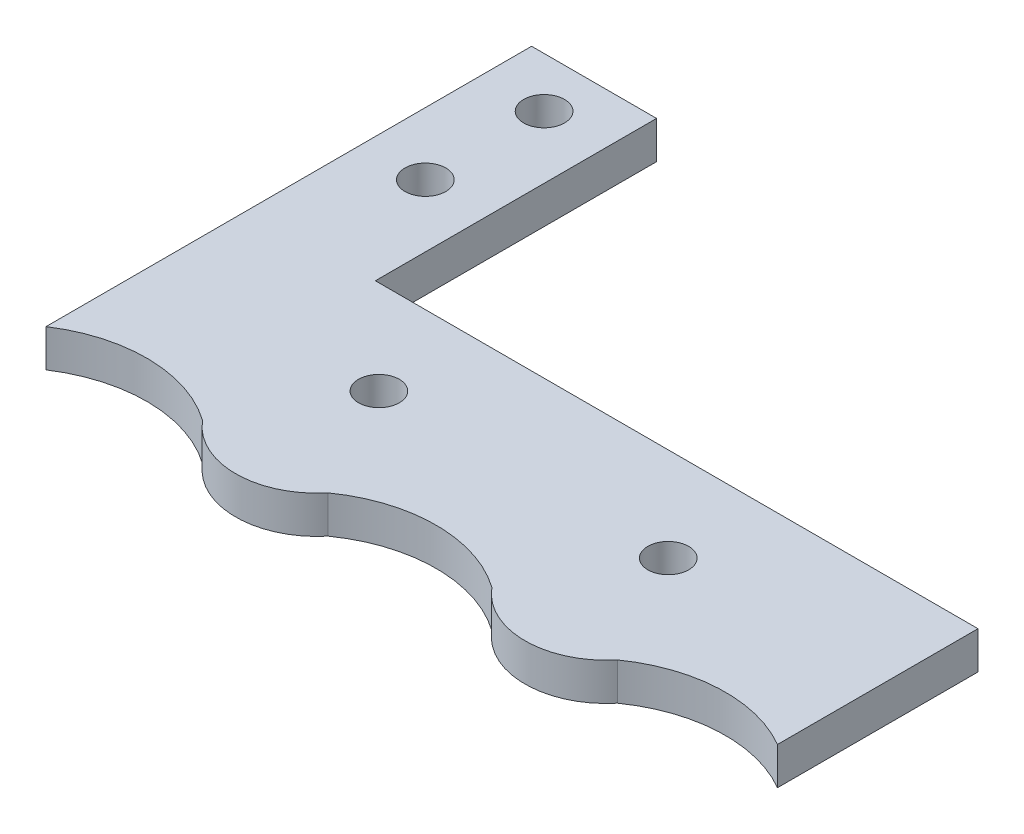
ISO-10303-21;
HEADER;
FILE_DESCRIPTION(('STEP AP214'),'2;1');
FILE_NAME('part.step','',(''),(''),'','','');
FILE_SCHEMA(('AUTOMOTIVE_DESIGN { 1 0 10303 214 1 1 1 1 }'));
ENDSEC;
DATA;
#1=APPLICATION_CONTEXT('core data for automotive mechanical design processes');
#2=APPLICATION_PROTOCOL_DEFINITION('international standard','automotive_design',2000,#1);
#3=PRODUCT_CONTEXT('',#1,'mechanical');
#4=PRODUCT('Part','Part','',(#3));
#5=PRODUCT_RELATED_PRODUCT_CATEGORY('part','',(#4));
#6=PRODUCT_DEFINITION_FORMATION('','',#4);
#7=PRODUCT_DEFINITION_CONTEXT('part definition',#1,'design');
#8=PRODUCT_DEFINITION('design','',#6,#7);
#9=PRODUCT_DEFINITION_SHAPE('','',#8);
#10=(LENGTH_UNIT() NAMED_UNIT(*) SI_UNIT(.MILLI.,.METRE.));
#11=(NAMED_UNIT(*) PLANE_ANGLE_UNIT() SI_UNIT($,.RADIAN.));
#12=(NAMED_UNIT(*) SI_UNIT($,.STERADIAN.) SOLID_ANGLE_UNIT());
#13=UNCERTAINTY_MEASURE_WITH_UNIT(LENGTH_MEASURE(1.E-05),#10,'distance_accuracy_value','');
#14=(GEOMETRIC_REPRESENTATION_CONTEXT(3) GLOBAL_UNCERTAINTY_ASSIGNED_CONTEXT((#13)) GLOBAL_UNIT_ASSIGNED_CONTEXT((#10,
#11,#12)) REPRESENTATION_CONTEXT('',''));
#15=CARTESIAN_POINT('',(0.,0.,0.));
#16=DIRECTION('',(0.,0.,1.));
#17=DIRECTION('',(1.,0.,0.));
#18=AXIS2_PLACEMENT_3D('',#15,#16,#17);
#19=CARTESIAN_POINT('',(-23.15,0.,0.));
#20=DIRECTION('',(0.,-1.,0.));
#21=DIRECTION('',(0.,0.,-1.));
#22=AXIS2_PLACEMENT_3D('',#19,#20,#21);
#23=PLANE('',#22);
#24=CARTESIAN_POINT('',(-11.575,0.,-18.325));
#25=DIRECTION('',(0.,-1.,0.));
#26=DIRECTION('',(0.,0.,-1.));
#27=AXIS2_PLACEMENT_3D('',#24,#25,#26);
#28=CIRCLE('',#27,1.63195);
#29=CARTESIAN_POINT('',(-11.575,0.,-19.95695));
#30=VERTEX_POINT('',#29);
#31=EDGE_CURVE('E175',#30,#30,#28,.F.);
#32=ORIENTED_EDGE('',*,*,#31,.F.);
#33=EDGE_LOOP('',(#32));
#34=FACE_BOUND('',#33,.T.);
#35=CARTESIAN_POINT('',(-24.3589649235001,0.,-44.325));
#36=DIRECTION('',(0.,1.,0.));
#37=DIRECTION('',(0.,0.,1.));
#38=AXIS2_PLACEMENT_3D('',#35,#36,#37);
#39=CIRCLE('',#38,1.635);
#40=CARTESIAN_POINT('',(-24.3589649235001,0.,-42.69));
#41=VERTEX_POINT('',#40);
#42=EDGE_CURVE('E187',#41,#41,#39,.T.);
#43=ORIENTED_EDGE('',*,*,#42,.F.);
#44=EDGE_LOOP('',(#43));
#45=FACE_BOUND('',#44,.T.);
#46=CARTESIAN_POINT('',(-24.3589649235001,0.,-34.825));
#47=DIRECTION('',(0.,1.,0.));
#48=DIRECTION('',(0.,0.,1.));
#49=AXIS2_PLACEMENT_3D('',#46,#47,#48);
#50=CIRCLE('',#49,1.635);
#51=CARTESIAN_POINT('',(-24.3589649235001,0.,-33.19));
#52=VERTEX_POINT('',#51);
#53=EDGE_CURVE('E191',#52,#52,#50,.T.);
#54=ORIENTED_EDGE('',*,*,#53,.F.);
#55=EDGE_LOOP('',(#54));
#56=FACE_BOUND('',#55,.T.);
#57=CARTESIAN_POINT('',(23.15,0.,0.));
#58=DIRECTION('',(0.,-1.,0.));
#59=DIRECTION('',(0.,0.,-1.));
#60=AXIS2_PLACEMENT_3D('',#57,#58,#59);
#61=CIRCLE('',#60,11.325);
#62=CARTESIAN_POINT('',(28.8589649235001,0.,-9.78076400401553));
#63=VERTEX_POINT('',#62);
#64=CARTESIAN_POINT('',(16.5986509739885,0.,-9.23771892511231));
#65=VERTEX_POINT('',#64);
#66=EDGE_CURVE('E230',#63,#65,#61,.F.);
#67=ORIENTED_EDGE('',*,*,#66,.F.);
#68=DIRECTION('',(0.,0.,1.));
#69=VECTOR('',#68,1.);
#70=CARTESIAN_POINT('',(28.8589649235001,0.,-9.78076400401553));
#71=LINE('',#70,#69);
#72=CARTESIAN_POINT('',(28.8589649235001,0.,-25.825));
#73=VERTEX_POINT('',#72);
#74=EDGE_CURVE('E154',#73,#63,#71,.T.);
#75=ORIENTED_EDGE('',*,*,#74,.F.);
#76=DIRECTION('',(-1.,0.,0.));
#77=VECTOR('',#76,1.);
#78=CARTESIAN_POINT('',(-19.3589649235001,0.,-25.825));
#79=LINE('',#78,#77);
#80=CARTESIAN_POINT('',(-19.3589649235001,0.,-25.825));
#81=VERTEX_POINT('',#80);
#82=EDGE_CURVE('E194',#73,#81,#79,.T.);
#83=ORIENTED_EDGE('',*,*,#82,.T.);
#84=DIRECTION('',(0.,0.,-1.));
#85=VECTOR('',#84,1.);
#86=CARTESIAN_POINT('',(-19.3589649235001,0.,-48.325));
#87=LINE('',#86,#85);
#88=CARTESIAN_POINT('',(-19.3589649235001,0.,-48.325));
#89=VERTEX_POINT('',#88);
#90=EDGE_CURVE('E210',#81,#89,#87,.T.);
#91=ORIENTED_EDGE('',*,*,#90,.T.);
#92=DIRECTION('',(-1.,0.,0.));
#93=VECTOR('',#92,1.);
#94=CARTESIAN_POINT('',(-29.3589649235001,0.,-48.325));
#95=LINE('',#94,#93);
#96=CARTESIAN_POINT('',(-29.3589649235001,0.,-48.325));
#97=VERTEX_POINT('',#96);
#98=EDGE_CURVE('E213',#89,#97,#95,.T.);
#99=ORIENTED_EDGE('',*,*,#98,.T.);
#100=DIRECTION('',(0.,0.,1.));
#101=VECTOR('',#100,1.);
#102=CARTESIAN_POINT('',(-29.3589649235001,0.,-8.86732087942835));
#103=LINE('',#102,#101);
#104=CARTESIAN_POINT('',(-29.3589649235001,0.,-9.47123960095752));
#105=VERTEX_POINT('',#104);
#106=EDGE_CURVE('E82',#97,#105,#103,.T.);
#107=ORIENTED_EDGE('',*,*,#106,.T.);
#108=CARTESIAN_POINT('',(-23.15,0.,0.));
#109=DIRECTION('',(0.,-1.,0.));
#110=DIRECTION('',(0.,0.,-1.));
#111=AXIS2_PLACEMENT_3D('',#108,#109,#110);
#112=CIRCLE('',#111,11.325);
#113=CARTESIAN_POINT('',(-16.5986509739885,0.,-9.23771892511232));
#114=VERTEX_POINT('',#113);
#115=EDGE_CURVE('E165',#114,#105,#112,.F.);
#116=ORIENTED_EDGE('',*,*,#115,.F.);
#117=CARTESIAN_POINT('',(-11.575,0.,-13.3623923535845));
#118=DIRECTION('',(0.,-1.,0.));
#119=DIRECTION('',(0.,0.,-1.));
#120=AXIS2_PLACEMENT_3D('',#117,#118,#119);
#121=CIRCLE('',#120,6.5);
#122=CARTESIAN_POINT('',(-6.5513490260115,0.,-9.23771892511231));
#123=VERTEX_POINT('',#122);
#124=EDGE_CURVE('E140',#123,#114,#121,.T.);
#125=ORIENTED_EDGE('',*,*,#124,.F.);
#126=CARTESIAN_POINT('',(0.,0.,0.));
#127=DIRECTION('',(0.,-1.,0.));
#128=DIRECTION('',(0.,0.,-1.));
#129=AXIS2_PLACEMENT_3D('',#126,#127,#128);
#130=CIRCLE('',#129,11.325);
#131=CARTESIAN_POINT('',(6.55134902601148,0.,-9.23771892511233));
#132=VERTEX_POINT('',#131);
#133=EDGE_CURVE('E236',#132,#123,#130,.F.);
#134=ORIENTED_EDGE('',*,*,#133,.F.);
#135=CARTESIAN_POINT('',(11.575,0.,-13.3623923535845));
#136=DIRECTION('',(0.,-1.,0.));
#137=DIRECTION('',(0.,0.,-1.));
#138=AXIS2_PLACEMENT_3D('',#135,#136,#137);
#139=CIRCLE('',#138,6.5);
#140=EDGE_CURVE('E233',#65,#132,#139,.T.);
#141=ORIENTED_EDGE('',*,*,#140,.F.);
#142=EDGE_LOOP('',(#67,#75,#83,#91,#99,#107,#116,#125,#134,#141));
#143=FACE_BOUND('',#142,.T.);
#144=CARTESIAN_POINT('',(11.575,0.,-18.325));
#145=DIRECTION('',(0.,-1.,0.));
#146=DIRECTION('',(0.,0.,-1.));
#147=AXIS2_PLACEMENT_3D('',#144,#145,#146);
#148=CIRCLE('',#147,1.63195);
#149=CARTESIAN_POINT('',(11.575,0.,-19.95695));
#150=VERTEX_POINT('',#149);
#151=EDGE_CURVE('E181',#150,#150,#148,.F.);
#152=ORIENTED_EDGE('',*,*,#151,.F.);
#153=EDGE_LOOP('',(#152));
#154=FACE_BOUND('',#153,.T.);
#155=ADVANCED_FACE('F45',(#34,#45,#56,#143,#154),#23,.F.);
#156=CARTESIAN_POINT('',(-29.3589649235001,-3.,-8.86732087942835));
#157=DIRECTION('',(-1.,0.,0.));
#158=DIRECTION('',(0.,0.,1.));
#159=AXIS2_PLACEMENT_3D('',#156,#157,#158);
#160=PLANE('',#159);
#161=DIRECTION('',(0.,-1.,0.));
#162=VECTOR('',#161,1.);
#163=CARTESIAN_POINT('',(-29.3589649235001,66.7840576637726,-9.47123960095752));
#164=LINE('',#163,#162);
#165=CARTESIAN_POINT('',(-29.3589649235001,-3.,-9.47123960095752));
#166=VERTEX_POINT('',#165);
#167=EDGE_CURVE('E59',#105,#166,#164,.T.);
#168=ORIENTED_EDGE('',*,*,#167,.F.);
#169=ORIENTED_EDGE('',*,*,#106,.F.);
#170=DIRECTION('',(0.,1.,0.));
#171=VECTOR('',#170,1.);
#172=CARTESIAN_POINT('',(-29.3589649235001,-3.,-48.325));
#173=LINE('',#172,#171);
#174=CARTESIAN_POINT('',(-29.3589649235001,-3.,-48.325));
#175=VERTEX_POINT('',#174);
#176=EDGE_CURVE('E53',#175,#97,#173,.T.);
#177=ORIENTED_EDGE('',*,*,#176,.F.);
#178=DIRECTION('',(0.,0.,1.));
#179=VECTOR('',#178,1.);
#180=CARTESIAN_POINT('',(-29.3589649235001,-3.,-25.825));
#181=LINE('',#180,#179);
#182=EDGE_CURVE('E206',#175,#166,#181,.T.);
#183=ORIENTED_EDGE('',*,*,#182,.T.);
#184=EDGE_LOOP('',(#168,#169,#177,#183));
#185=FACE_BOUND('',#184,.T.);
#186=ADVANCED_FACE('F241',(#185),#160,.T.);
#187=CARTESIAN_POINT('',(-29.3589649235001,-3.,-48.325));
#188=DIRECTION('',(0.,0.,-1.));
#189=DIRECTION('',(-1.,0.,0.));
#190=AXIS2_PLACEMENT_3D('',#187,#188,#189);
#191=PLANE('',#190);
#192=ORIENTED_EDGE('',*,*,#98,.F.);
#193=DIRECTION('',(0.,1.,0.));
#194=VECTOR('',#193,1.);
#195=CARTESIAN_POINT('',(-19.3589649235001,-3.,-48.325));
#196=LINE('',#195,#194);
#197=CARTESIAN_POINT('',(-19.3589649235001,-3.,-48.325));
#198=VERTEX_POINT('',#197);
#199=EDGE_CURVE('E218',#198,#89,#196,.T.);
#200=ORIENTED_EDGE('',*,*,#199,.F.);
#201=DIRECTION('',(-1.,0.,0.));
#202=VECTOR('',#201,1.);
#203=CARTESIAN_POINT('',(-29.3589649235001,-3.,-48.325));
#204=LINE('',#203,#202);
#205=EDGE_CURVE('E203',#198,#175,#204,.T.);
#206=ORIENTED_EDGE('',*,*,#205,.T.);
#207=ORIENTED_EDGE('',*,*,#176,.T.);
#208=EDGE_LOOP('',(#192,#200,#206,#207));
#209=FACE_BOUND('',#208,.T.);
#210=ADVANCED_FACE('F244',(#209),#191,.T.);
#211=CARTESIAN_POINT('',(-19.3589649235001,-3.,-48.325));
#212=DIRECTION('',(1.,0.,0.));
#213=DIRECTION('',(0.,0.,-1.));
#214=AXIS2_PLACEMENT_3D('',#211,#212,#213);
#215=PLANE('',#214);
#216=ORIENTED_EDGE('',*,*,#90,.F.);
#217=DIRECTION('',(0.,1.,0.));
#218=VECTOR('',#217,1.);
#219=CARTESIAN_POINT('',(-19.3589649235001,-3.,-25.825));
#220=LINE('',#219,#218);
#221=CARTESIAN_POINT('',(-19.3589649235001,-3.,-25.825));
#222=VERTEX_POINT('',#221);
#223=EDGE_CURVE('E208',#222,#81,#220,.T.);
#224=ORIENTED_EDGE('',*,*,#223,.F.);
#225=DIRECTION('',(0.,0.,-1.));
#226=VECTOR('',#225,1.);
#227=CARTESIAN_POINT('',(-19.3589649235001,-3.,-48.325));
#228=LINE('',#227,#226);
#229=EDGE_CURVE('E200',#222,#198,#228,.T.);
#230=ORIENTED_EDGE('',*,*,#229,.T.);
#231=ORIENTED_EDGE('',*,*,#199,.T.);
#232=EDGE_LOOP('',(#216,#224,#230,#231));
#233=FACE_BOUND('',#232,.T.);
#234=ADVANCED_FACE('F223',(#233),#215,.T.);
#235=CARTESIAN_POINT('',(-19.3589649235001,-3.,-25.825));
#236=DIRECTION('',(0.,0.,-1.));
#237=DIRECTION('',(-1.,0.,0.));
#238=AXIS2_PLACEMENT_3D('',#235,#236,#237);
#239=PLANE('',#238);
#240=DIRECTION('',(0.,-1.,0.));
#241=VECTOR('',#240,1.);
#242=CARTESIAN_POINT('',(28.8589649235001,66.7840576637726,-25.825));
#243=LINE('',#242,#241);
#244=CARTESIAN_POINT('',(28.8589649235001,-3.,-25.825));
#245=VERTEX_POINT('',#244);
#246=EDGE_CURVE('E163',#73,#245,#243,.T.);
#247=ORIENTED_EDGE('',*,*,#246,.T.);
#248=DIRECTION('',(-1.,0.,0.));
#249=VECTOR('',#248,1.);
#250=CARTESIAN_POINT('',(-19.3589649235001,-3.,-25.825));
#251=LINE('',#250,#249);
#252=EDGE_CURVE('E88',#245,#222,#251,.T.);
#253=ORIENTED_EDGE('',*,*,#252,.T.);
#254=ORIENTED_EDGE('',*,*,#223,.T.);
#255=ORIENTED_EDGE('',*,*,#82,.F.);
#256=EDGE_LOOP('',(#247,#253,#254,#255));
#257=FACE_BOUND('',#256,.T.);
#258=ADVANCED_FACE('F47',(#257),#239,.T.);
#259=CARTESIAN_POINT('',(-23.15,-3.,0.));
#260=DIRECTION('',(0.,-1.,0.));
#261=DIRECTION('',(0.,0.,-1.));
#262=AXIS2_PLACEMENT_3D('',#259,#260,#261);
#263=PLANE('',#262);
#264=DIRECTION('',(0.,0.,-1.));
#265=VECTOR('',#264,1.);
#266=CARTESIAN_POINT('',(28.8589649235001,-3.,-9.78076400401553));
#267=LINE('',#266,#265);
#268=CARTESIAN_POINT('',(28.8589649235001,-3.,-9.78076400401553));
#269=VERTEX_POINT('',#268);
#270=EDGE_CURVE('E142',#269,#245,#267,.T.);
#271=ORIENTED_EDGE('',*,*,#270,.F.);
#272=CARTESIAN_POINT('',(23.15,-3.,0.));
#273=DIRECTION('',(0.,-1.,0.));
#274=DIRECTION('',(0.,0.,-1.));
#275=AXIS2_PLACEMENT_3D('',#272,#273,#274);
#276=CIRCLE('',#275,11.325);
#277=CARTESIAN_POINT('',(16.5986509739885,-3.,-9.23771892511231));
#278=VERTEX_POINT('',#277);
#279=EDGE_CURVE('E159',#278,#269,#276,.T.);
#280=ORIENTED_EDGE('',*,*,#279,.F.);
#281=CARTESIAN_POINT('',(11.575,-3.,-13.3623923535845));
#282=DIRECTION('',(0.,1.,0.));
#283=DIRECTION('',(0.,0.,-1.));
#284=AXIS2_PLACEMENT_3D('',#281,#282,#283);
#285=CIRCLE('',#284,6.5);
#286=CARTESIAN_POINT('',(6.55134902601148,-3.,-9.23771892511233));
#287=VERTEX_POINT('',#286);
#288=EDGE_CURVE('E151',#287,#278,#285,.T.);
#289=ORIENTED_EDGE('',*,*,#288,.F.);
#290=CARTESIAN_POINT('',(0.,-3.,0.));
#291=DIRECTION('',(0.,-1.,0.));
#292=DIRECTION('',(0.,0.,-1.));
#293=AXIS2_PLACEMENT_3D('',#290,#291,#292);
#294=CIRCLE('',#293,11.325);
#295=CARTESIAN_POINT('',(-6.5513490260115,-3.,-9.23771892511231));
#296=VERTEX_POINT('',#295);
#297=EDGE_CURVE('E149',#296,#287,#294,.T.);
#298=ORIENTED_EDGE('',*,*,#297,.F.);
#299=CARTESIAN_POINT('',(-11.575,-3.,-13.3623923535845));
#300=DIRECTION('',(0.,1.,0.));
#301=DIRECTION('',(0.,0.,-1.));
#302=AXIS2_PLACEMENT_3D('',#299,#300,#301);
#303=CIRCLE('',#302,6.5);
#304=CARTESIAN_POINT('',(-16.5986509739885,-3.,-9.23771892511232));
#305=VERTEX_POINT('',#304);
#306=EDGE_CURVE('E137',#305,#296,#303,.T.);
#307=ORIENTED_EDGE('',*,*,#306,.F.);
#308=CARTESIAN_POINT('',(-23.15,-3.,0.));
#309=DIRECTION('',(0.,-1.,0.));
#310=DIRECTION('',(0.,0.,-1.));
#311=AXIS2_PLACEMENT_3D('',#308,#309,#310);
#312=CIRCLE('',#311,11.325);
#313=EDGE_CURVE('E11',#166,#305,#312,.T.);
#314=ORIENTED_EDGE('',*,*,#313,.F.);
#315=ORIENTED_EDGE('',*,*,#182,.F.);
#316=ORIENTED_EDGE('',*,*,#205,.F.);
#317=ORIENTED_EDGE('',*,*,#229,.F.);
#318=ORIENTED_EDGE('',*,*,#252,.F.);
#319=EDGE_LOOP('',(#271,#280,#289,#298,#307,#314,#315,#316,#317,#318));
#320=FACE_BOUND('',#319,.T.);
#321=CARTESIAN_POINT('',(-11.575,-3.,-18.325));
#322=DIRECTION('',(0.,-1.,0.));
#323=DIRECTION('',(0.,0.,-1.));
#324=AXIS2_PLACEMENT_3D('',#321,#322,#323);
#325=CIRCLE('',#324,1.63195);
#326=CARTESIAN_POINT('',(-11.575,-3.,-19.95695));
#327=VERTEX_POINT('',#326);
#328=EDGE_CURVE('E174',#327,#327,#325,.T.);
#329=ORIENTED_EDGE('',*,*,#328,.F.);
#330=EDGE_LOOP('',(#329));
#331=FACE_BOUND('',#330,.T.);
#332=CARTESIAN_POINT('',(11.575,-3.,-18.325));
#333=DIRECTION('',(0.,-1.,0.));
#334=DIRECTION('',(0.,0.,-1.));
#335=AXIS2_PLACEMENT_3D('',#332,#333,#334);
#336=CIRCLE('',#335,1.63195);
#337=CARTESIAN_POINT('',(11.575,-3.,-19.95695));
#338=VERTEX_POINT('',#337);
#339=EDGE_CURVE('E178',#338,#338,#336,.T.);
#340=ORIENTED_EDGE('',*,*,#339,.F.);
#341=EDGE_LOOP('',(#340));
#342=FACE_BOUND('',#341,.T.);
#343=CARTESIAN_POINT('',(-24.3589649235001,-3.,-44.325));
#344=DIRECTION('',(0.,-1.,0.));
#345=DIRECTION('',(0.,0.,-1.));
#346=AXIS2_PLACEMENT_3D('',#343,#344,#345);
#347=CIRCLE('',#346,1.635);
#348=CARTESIAN_POINT('',(-24.3589649235001,-3.,-45.96));
#349=VERTEX_POINT('',#348);
#350=EDGE_CURVE('E190',#349,#349,#347,.F.);
#351=ORIENTED_EDGE('',*,*,#350,.T.);
#352=EDGE_LOOP('',(#351));
#353=FACE_BOUND('',#352,.T.);
#354=CARTESIAN_POINT('',(-24.3589649235001,-3.,-34.825));
#355=DIRECTION('',(0.,-1.,0.));
#356=DIRECTION('',(0.,0.,-1.));
#357=AXIS2_PLACEMENT_3D('',#354,#355,#356);
#358=CIRCLE('',#357,1.635);
#359=CARTESIAN_POINT('',(-24.3589649235001,-3.,-36.46));
#360=VERTEX_POINT('',#359);
#361=EDGE_CURVE('E184',#360,#360,#358,.F.);
#362=ORIENTED_EDGE('',*,*,#361,.T.);
#363=EDGE_LOOP('',(#362));
#364=FACE_BOUND('',#363,.T.);
#365=ADVANCED_FACE('F145',(#320,#331,#342,#353,#364),#263,.T.);
#366=CARTESIAN_POINT('',(-24.3589649235001,-7.62447834896003,-34.825));
#367=DIRECTION('',(0.,1.,0.));
#368=DIRECTION('',(0.,0.,1.));
#369=AXIS2_PLACEMENT_3D('',#366,#367,#368);
#370=CYLINDRICAL_SURFACE('',#369,1.635);
#371=ORIENTED_EDGE('',*,*,#53,.T.);
#372=EDGE_LOOP('',(#371));
#373=FACE_BOUND('',#372,.T.);
#374=ORIENTED_EDGE('',*,*,#361,.F.);
#375=EDGE_LOOP('',(#374));
#376=FACE_BOUND('',#375,.T.);
#377=ADVANCED_FACE('F263',(#373,#376),#370,.F.);
#378=CARTESIAN_POINT('',(-24.3589649235001,-7.62447834896003,-44.325));
#379=DIRECTION('',(0.,1.,0.));
#380=DIRECTION('',(0.,0.,1.));
#381=AXIS2_PLACEMENT_3D('',#378,#379,#380);
#382=CYLINDRICAL_SURFACE('',#381,1.635);
#383=ORIENTED_EDGE('',*,*,#42,.T.);
#384=EDGE_LOOP('',(#383));
#385=FACE_BOUND('',#384,.T.);
#386=ORIENTED_EDGE('',*,*,#350,.F.);
#387=EDGE_LOOP('',(#386));
#388=FACE_BOUND('',#387,.T.);
#389=ADVANCED_FACE('F266',(#385,#388),#382,.F.);
#390=CARTESIAN_POINT('',(11.575,-3.,-18.325));
#391=DIRECTION('',(0.,-1.,0.));
#392=DIRECTION('',(0.,0.,-1.));
#393=AXIS2_PLACEMENT_3D('',#390,#391,#392);
#394=CYLINDRICAL_SURFACE('',#393,1.63195);
#395=ORIENTED_EDGE('',*,*,#151,.T.);
#396=EDGE_LOOP('',(#395));
#397=FACE_BOUND('',#396,.T.);
#398=ORIENTED_EDGE('',*,*,#339,.T.);
#399=EDGE_LOOP('',(#398));
#400=FACE_BOUND('',#399,.T.);
#401=ADVANCED_FACE('F270',(#397,#400),#394,.F.);
#402=CARTESIAN_POINT('',(-11.575,-3.,-18.325));
#403=DIRECTION('',(0.,-1.,0.));
#404=DIRECTION('',(0.,0.,-1.));
#405=AXIS2_PLACEMENT_3D('',#402,#403,#404);
#406=CYLINDRICAL_SURFACE('',#405,1.63195);
#407=ORIENTED_EDGE('',*,*,#31,.T.);
#408=EDGE_LOOP('',(#407));
#409=FACE_BOUND('',#408,.T.);
#410=ORIENTED_EDGE('',*,*,#328,.T.);
#411=EDGE_LOOP('',(#410));
#412=FACE_BOUND('',#411,.T.);
#413=ADVANCED_FACE('F274',(#409,#412),#406,.F.);
#414=CARTESIAN_POINT('',(28.8589649235001,66.7840576637726,-9.78076400401553));
#415=DIRECTION('',(-1.,0.,0.));
#416=DIRECTION('',(0.,0.,1.));
#417=AXIS2_PLACEMENT_3D('',#414,#415,#416);
#418=PLANE('',#417);
#419=ORIENTED_EDGE('',*,*,#74,.T.);
#420=DIRECTION('',(0.,-1.,0.));
#421=VECTOR('',#420,1.);
#422=CARTESIAN_POINT('',(28.8589649235001,66.7840576637726,-9.78076400401553));
#423=LINE('',#422,#421);
#424=EDGE_CURVE('E166',#63,#269,#423,.T.);
#425=ORIENTED_EDGE('',*,*,#424,.T.);
#426=ORIENTED_EDGE('',*,*,#270,.T.);
#427=ORIENTED_EDGE('',*,*,#246,.F.);
#428=EDGE_LOOP('',(#419,#425,#426,#427));
#429=FACE_BOUND('',#428,.T.);
#430=ADVANCED_FACE('F277',(#429),#418,.F.);
#431=CARTESIAN_POINT('',(23.15,66.7840576637726,0.));
#432=DIRECTION('',(0.,-1.,0.));
#433=DIRECTION('',(0.,0.,-1.));
#434=AXIS2_PLACEMENT_3D('',#431,#432,#433);
#435=CYLINDRICAL_SURFACE('',#434,11.325);
#436=ORIENTED_EDGE('',*,*,#66,.T.);
#437=DIRECTION('',(0.,-1.,0.));
#438=VECTOR('',#437,1.);
#439=CARTESIAN_POINT('',(16.5986509739885,66.7840576637726,-9.23771892511231));
#440=LINE('',#439,#438);
#441=EDGE_CURVE('E168',#65,#278,#440,.T.);
#442=ORIENTED_EDGE('',*,*,#441,.T.);
#443=ORIENTED_EDGE('',*,*,#279,.T.);
#444=ORIENTED_EDGE('',*,*,#424,.F.);
#445=EDGE_LOOP('',(#436,#442,#443,#444));
#446=FACE_BOUND('',#445,.T.);
#447=ADVANCED_FACE('F290',(#446),#435,.F.);
#448=CARTESIAN_POINT('',(11.575,66.7840576637726,-13.3623923535845));
#449=DIRECTION('',(0.,-1.,0.));
#450=DIRECTION('',(0.,0.,-1.));
#451=AXIS2_PLACEMENT_3D('',#448,#449,#450);
#452=CYLINDRICAL_SURFACE('',#451,6.5);
#453=ORIENTED_EDGE('',*,*,#140,.T.);
#454=DIRECTION('',(0.,-1.,0.));
#455=VECTOR('',#454,1.);
#456=CARTESIAN_POINT('',(6.55134902601148,66.7840576637726,-9.23771892511233));
#457=LINE('',#456,#455);
#458=EDGE_CURVE('E170',#132,#287,#457,.T.);
#459=ORIENTED_EDGE('',*,*,#458,.T.);
#460=ORIENTED_EDGE('',*,*,#288,.T.);
#461=ORIENTED_EDGE('',*,*,#441,.F.);
#462=EDGE_LOOP('',(#453,#459,#460,#461));
#463=FACE_BOUND('',#462,.T.);
#464=ADVANCED_FACE('F286',(#463),#452,.T.);
#465=CARTESIAN_POINT('',(0.,66.7840576637726,0.));
#466=DIRECTION('',(0.,-1.,0.));
#467=DIRECTION('',(0.,0.,-1.));
#468=AXIS2_PLACEMENT_3D('',#465,#466,#467);
#469=CYLINDRICAL_SURFACE('',#468,11.325);
#470=ORIENTED_EDGE('',*,*,#133,.T.);
#471=DIRECTION('',(0.,-1.,0.));
#472=VECTOR('',#471,1.);
#473=CARTESIAN_POINT('',(-6.5513490260115,66.7840576637726,-9.23771892511231));
#474=LINE('',#473,#472);
#475=EDGE_CURVE('E141',#123,#296,#474,.T.);
#476=ORIENTED_EDGE('',*,*,#475,.T.);
#477=ORIENTED_EDGE('',*,*,#297,.T.);
#478=ORIENTED_EDGE('',*,*,#458,.F.);
#479=EDGE_LOOP('',(#470,#476,#477,#478));
#480=FACE_BOUND('',#479,.T.);
#481=ADVANCED_FACE('F283',(#480),#469,.F.);
#482=CARTESIAN_POINT('',(-11.575,66.7840576637726,-13.3623923535845));
#483=DIRECTION('',(0.,-1.,0.));
#484=DIRECTION('',(0.,0.,-1.));
#485=AXIS2_PLACEMENT_3D('',#482,#483,#484);
#486=CYLINDRICAL_SURFACE('',#485,6.5);
#487=ORIENTED_EDGE('',*,*,#124,.T.);
#488=DIRECTION('',(0.,-1.,0.));
#489=VECTOR('',#488,1.);
#490=CARTESIAN_POINT('',(-16.5986509739885,66.7840576637726,-9.23771892511232));
#491=LINE('',#490,#489);
#492=EDGE_CURVE('E129',#114,#305,#491,.T.);
#493=ORIENTED_EDGE('',*,*,#492,.T.);
#494=ORIENTED_EDGE('',*,*,#306,.T.);
#495=ORIENTED_EDGE('',*,*,#475,.F.);
#496=EDGE_LOOP('',(#487,#493,#494,#495));
#497=FACE_BOUND('',#496,.T.);
#498=ADVANCED_FACE('F135',(#497),#486,.T.);
#499=CARTESIAN_POINT('',(-23.15,66.7840576637726,0.));
#500=DIRECTION('',(0.,-1.,0.));
#501=DIRECTION('',(0.,0.,-1.));
#502=AXIS2_PLACEMENT_3D('',#499,#500,#501);
#503=CYLINDRICAL_SURFACE('',#502,11.325);
#504=ORIENTED_EDGE('',*,*,#167,.T.);
#505=ORIENTED_EDGE('',*,*,#313,.T.);
#506=ORIENTED_EDGE('',*,*,#492,.F.);
#507=ORIENTED_EDGE('',*,*,#115,.T.);
#508=EDGE_LOOP('',(#504,#505,#506,#507));
#509=FACE_BOUND('',#508,.T.);
#510=ADVANCED_FACE('F128',(#509),#503,.F.);
#511=CLOSED_SHELL('',(#155,#186,#210,#234,#258,#365,#377,#389,#401,#413,#430,#447,#464,#481,
#498,#510));
#512=MANIFOLD_SOLID_BREP('B2',#511);
#513=ADVANCED_BREP_SHAPE_REPRESENTATION('',(#18,#512),#14);
#514=SHAPE_DEFINITION_REPRESENTATION(#9,#513);
ENDSEC;
END-ISO-10303-21;
